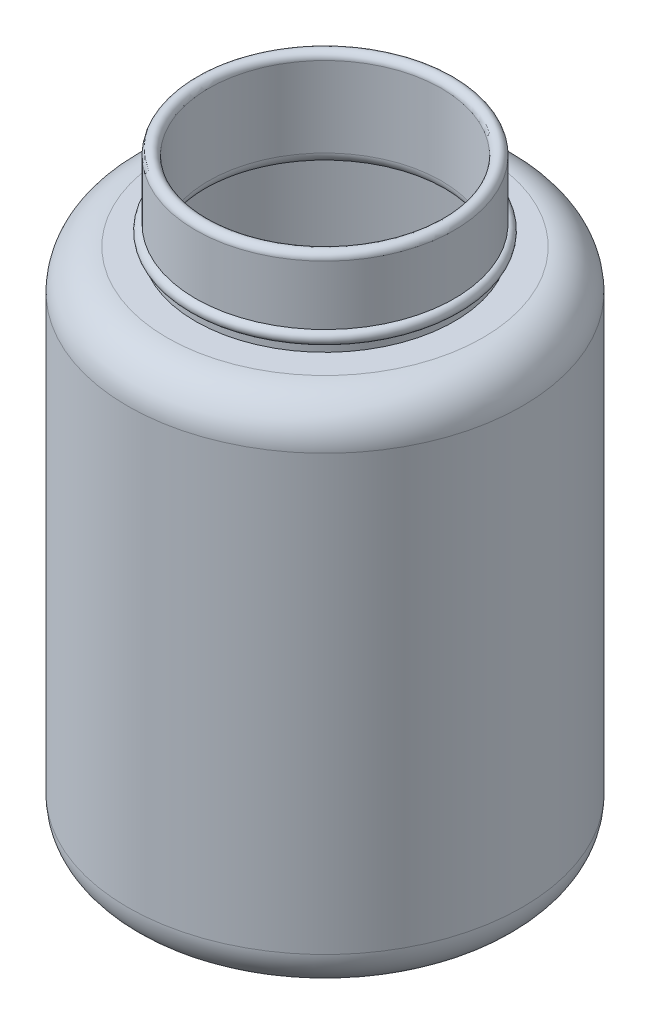
ISO-10303-21;
HEADER;
FILE_DESCRIPTION(('STEP AP214'),'2;1');
FILE_NAME('part.step','',(''),(''),'','','');
FILE_SCHEMA(('AUTOMOTIVE_DESIGN { 1 0 10303 214 1 1 1 1 }'));
ENDSEC;
DATA;
#1=APPLICATION_CONTEXT('core data for automotive mechanical design processes');
#2=APPLICATION_PROTOCOL_DEFINITION('international standard','automotive_design',2000,#1);
#3=PRODUCT_CONTEXT('',#1,'mechanical');
#4=PRODUCT('Part','Part','',(#3));
#5=PRODUCT_RELATED_PRODUCT_CATEGORY('part','',(#4));
#6=PRODUCT_DEFINITION_FORMATION('','',#4);
#7=PRODUCT_DEFINITION_CONTEXT('part definition',#1,'design');
#8=PRODUCT_DEFINITION('design','',#6,#7);
#9=PRODUCT_DEFINITION_SHAPE('','',#8);
#10=(LENGTH_UNIT() NAMED_UNIT(*) SI_UNIT(.MILLI.,.METRE.));
#11=(NAMED_UNIT(*) PLANE_ANGLE_UNIT() SI_UNIT($,.RADIAN.));
#12=(NAMED_UNIT(*) SI_UNIT($,.STERADIAN.) SOLID_ANGLE_UNIT());
#13=UNCERTAINTY_MEASURE_WITH_UNIT(LENGTH_MEASURE(1.E-05),#10,'distance_accuracy_value','');
#14=(GEOMETRIC_REPRESENTATION_CONTEXT(3) GLOBAL_UNCERTAINTY_ASSIGNED_CONTEXT((#13)) GLOBAL_UNIT_ASSIGNED_CONTEXT((#10,
#11,#12)) REPRESENTATION_CONTEXT('',''));
#15=CARTESIAN_POINT('',(0.,0.,0.));
#16=DIRECTION('',(0.,0.,1.));
#17=DIRECTION('',(1.,0.,0.));
#18=AXIS2_PLACEMENT_3D('',#15,#16,#17);
#19=CARTESIAN_POINT('',(0.,0.,0.));
#20=DIRECTION('',(0.,-1.,0.));
#21=DIRECTION('',(0.,0.,-1.));
#22=AXIS2_PLACEMENT_3D('',#19,#20,#21);
#23=PLANE('',#22);
#24=CARTESIAN_POINT('',(0.,0.,0.));
#25=DIRECTION('',(0.,-1.,0.));
#26=DIRECTION('',(0.,0.,-1.));
#27=AXIS2_PLACEMENT_3D('',#24,#25,#26);
#28=CIRCLE('',#27,39.9999999999999);
#29=CARTESIAN_POINT('',(0.,0.,-39.9999999999999));
#30=VERTEX_POINT('',#29);
#31=EDGE_CURVE('E10',#30,#30,#28,.T.);
#32=ORIENTED_EDGE('',*,*,#31,.T.);
#33=EDGE_LOOP('',(#32));
#34=FACE_BOUND('',#33,.T.);
#35=ADVANCED_FACE('F30',(#34),#23,.T.);
#36=CARTESIAN_POINT('',(0.,10.,0.));
#37=DIRECTION('',(0.,-1.,0.));
#38=DIRECTION('',(0.,0.,-1.));
#39=AXIS2_PLACEMENT_3D('',#36,#37,#38);
#40=TOROIDAL_SURFACE('',#39,40.,10.);
#41=CARTESIAN_POINT('',(0.,10.0000000000001,0.));
#42=DIRECTION('',(0.,-1.,0.));
#43=DIRECTION('',(0.,0.,-1.));
#44=AXIS2_PLACEMENT_3D('',#41,#42,#43);
#45=CIRCLE('',#44,50.);
#46=CARTESIAN_POINT('',(0.,10.0000000000001,-50.));
#47=VERTEX_POINT('',#46);
#48=EDGE_CURVE('E36',#47,#47,#45,.T.);
#49=ORIENTED_EDGE('',*,*,#48,.T.);
#50=EDGE_LOOP('',(#49));
#51=FACE_BOUND('',#50,.T.);
#52=ORIENTED_EDGE('',*,*,#31,.F.);
#53=EDGE_LOOP('',(#52));
#54=FACE_BOUND('',#53,.T.);
#55=ADVANCED_FACE('F95',(#51,#54),#40,.T.);
#56=CARTESIAN_POINT('',(0.,0.,0.));
#57=DIRECTION('',(0.,-1.,0.));
#58=DIRECTION('',(0.,0.,-1.));
#59=AXIS2_PLACEMENT_3D('',#56,#57,#58);
#60=CYLINDRICAL_SURFACE('',#59,50.);
#61=CARTESIAN_POINT('',(0.,120.,0.));
#62=DIRECTION('',(0.,-1.,0.));
#63=DIRECTION('',(0.,0.,-1.));
#64=AXIS2_PLACEMENT_3D('',#61,#62,#63);
#65=CIRCLE('',#64,50.);
#66=CARTESIAN_POINT('',(0.,120.,-50.));
#67=VERTEX_POINT('',#66);
#68=EDGE_CURVE('E40',#67,#67,#65,.T.);
#69=ORIENTED_EDGE('',*,*,#68,.T.);
#70=EDGE_LOOP('',(#69));
#71=FACE_BOUND('',#70,.T.);
#72=ORIENTED_EDGE('',*,*,#48,.F.);
#73=EDGE_LOOP('',(#72));
#74=FACE_BOUND('',#73,.T.);
#75=ADVANCED_FACE('F99',(#71,#74),#60,.T.);
#76=CARTESIAN_POINT('',(0.,120.,0.));
#77=DIRECTION('',(0.,-1.,0.));
#78=DIRECTION('',(0.,0.,-1.));
#79=AXIS2_PLACEMENT_3D('',#76,#77,#78);
#80=TOROIDAL_SURFACE('',#79,40.,10.);
#81=CARTESIAN_POINT('',(0.,130.,0.));
#82=DIRECTION('',(0.,-1.,0.));
#83=DIRECTION('',(0.,0.,-1.));
#84=AXIS2_PLACEMENT_3D('',#81,#82,#83);
#85=CIRCLE('',#84,40.);
#86=CARTESIAN_POINT('',(0.,130.,-40.));
#87=VERTEX_POINT('',#86);
#88=EDGE_CURVE('E44',#87,#87,#85,.T.);
#89=ORIENTED_EDGE('',*,*,#88,.T.);
#90=EDGE_LOOP('',(#89));
#91=FACE_BOUND('',#90,.T.);
#92=ORIENTED_EDGE('',*,*,#68,.F.);
#93=EDGE_LOOP('',(#92));
#94=FACE_BOUND('',#93,.T.);
#95=ADVANCED_FACE('F103',(#91,#94),#80,.T.);
#96=CARTESIAN_POINT('',(40.,130.,0.));
#97=DIRECTION('',(0.,1.,0.));
#98=DIRECTION('',(0.,0.,1.));
#99=AXIS2_PLACEMENT_3D('',#96,#97,#98);
#100=PLANE('',#99);
#101=CARTESIAN_POINT('',(0.,130.,0.));
#102=DIRECTION('',(0.,-1.,0.));
#103=DIRECTION('',(0.,0.,-1.));
#104=AXIS2_PLACEMENT_3D('',#101,#102,#103);
#105=CIRCLE('',#104,32.8);
#106=CARTESIAN_POINT('',(0.,130.,-32.8));
#107=VERTEX_POINT('',#106);
#108=EDGE_CURVE('E49',#107,#107,#105,.T.);
#109=ORIENTED_EDGE('',*,*,#108,.T.);
#110=EDGE_LOOP('',(#109));
#111=FACE_BOUND('',#110,.T.);
#112=ORIENTED_EDGE('',*,*,#88,.F.);
#113=EDGE_LOOP('',(#112));
#114=FACE_BOUND('',#113,.T.);
#115=ADVANCED_FACE('F110',(#111,#114),#100,.T.);
#116=CARTESIAN_POINT('',(0.,0.,0.));
#117=DIRECTION('',(0.,-1.,0.));
#118=DIRECTION('',(0.,0.,-1.));
#119=AXIS2_PLACEMENT_3D('',#116,#117,#118);
#120=CYLINDRICAL_SURFACE('',#119,32.8);
#121=CARTESIAN_POINT('',(0.,132.,0.));
#122=DIRECTION('',(0.,-1.,0.));
#123=DIRECTION('',(0.,0.,-1.));
#124=AXIS2_PLACEMENT_3D('',#121,#122,#123);
#125=CIRCLE('',#124,32.8);
#126=CARTESIAN_POINT('',(0.,132.,-32.8));
#127=VERTEX_POINT('',#126);
#128=EDGE_CURVE('E52',#127,#127,#125,.T.);
#129=ORIENTED_EDGE('',*,*,#128,.T.);
#130=EDGE_LOOP('',(#129));
#131=FACE_BOUND('',#130,.T.);
#132=ORIENTED_EDGE('',*,*,#108,.F.);
#133=EDGE_LOOP('',(#132));
#134=FACE_BOUND('',#133,.T.);
#135=ADVANCED_FACE('F114',(#131,#134),#120,.T.);
#136=CARTESIAN_POINT('',(0.,133.5,0.));
#137=DIRECTION('',(0.,-1.,0.));
#138=DIRECTION('',(0.,0.,-1.));
#139=AXIS2_PLACEMENT_3D('',#136,#137,#138);
#140=TOROIDAL_SURFACE('',#139,32.8,1.5);
#141=CARTESIAN_POINT('',(0.,135.,0.));
#142=DIRECTION('',(0.,-1.,0.));
#143=DIRECTION('',(0.,0.,-1.));
#144=AXIS2_PLACEMENT_3D('',#141,#142,#143);
#145=CIRCLE('',#144,32.8);
#146=CARTESIAN_POINT('',(0.,135.,-32.8));
#147=VERTEX_POINT('',#146);
#148=EDGE_CURVE('E55',#147,#147,#145,.T.);
#149=ORIENTED_EDGE('',*,*,#148,.T.);
#150=EDGE_LOOP('',(#149));
#151=FACE_BOUND('',#150,.T.);
#152=ORIENTED_EDGE('',*,*,#128,.F.);
#153=EDGE_LOOP('',(#152));
#154=FACE_BOUND('',#153,.T.);
#155=ADVANCED_FACE('F118',(#151,#154),#140,.T.);
#156=CARTESIAN_POINT('',(0.,0.,0.));
#157=DIRECTION('',(0.,-1.,0.));
#158=DIRECTION('',(0.,0.,-1.));
#159=AXIS2_PLACEMENT_3D('',#156,#157,#158);
#160=CYLINDRICAL_SURFACE('',#159,32.8);
#161=CARTESIAN_POINT('',(0.,150.,0.));
#162=DIRECTION('',(0.,-1.,0.));
#163=DIRECTION('',(0.,0.,-1.));
#164=AXIS2_PLACEMENT_3D('',#161,#162,#163);
#165=CIRCLE('',#164,32.8);
#166=CARTESIAN_POINT('',(0.,150.,-32.8));
#167=VERTEX_POINT('',#166);
#168=EDGE_CURVE('E58',#167,#167,#165,.T.);
#169=ORIENTED_EDGE('',*,*,#168,.T.);
#170=EDGE_LOOP('',(#169));
#171=FACE_BOUND('',#170,.T.);
#172=ORIENTED_EDGE('',*,*,#148,.F.);
#173=EDGE_LOOP('',(#172));
#174=FACE_BOUND('',#173,.T.);
#175=ADVANCED_FACE('F122',(#171,#174),#160,.T.);
#176=CARTESIAN_POINT('',(0.,150.,0.));
#177=DIRECTION('',(0.,-1.,0.));
#178=DIRECTION('',(0.,0.,-1.));
#179=AXIS2_PLACEMENT_3D('',#176,#177,#178);
#180=TOROIDAL_SURFACE('',#179,31.15,1.65);
#181=CARTESIAN_POINT('',(0.,150.,0.));
#182=DIRECTION('',(0.,-1.,0.));
#183=DIRECTION('',(0.,0.,-1.));
#184=AXIS2_PLACEMENT_3D('',#181,#182,#183);
#185=CIRCLE('',#184,29.5);
#186=CARTESIAN_POINT('',(0.,150.,-29.5));
#187=VERTEX_POINT('',#186);
#188=EDGE_CURVE('E61',#187,#187,#185,.T.);
#189=ORIENTED_EDGE('',*,*,#188,.T.);
#190=EDGE_LOOP('',(#189));
#191=FACE_BOUND('',#190,.T.);
#192=ORIENTED_EDGE('',*,*,#168,.F.);
#193=EDGE_LOOP('',(#192));
#194=FACE_BOUND('',#193,.T.);
#195=ADVANCED_FACE('F126',(#191,#194),#180,.T.);
#196=CARTESIAN_POINT('',(0.,0.,0.));
#197=DIRECTION('',(0.,-1.,0.));
#198=DIRECTION('',(0.,0.,-1.));
#199=AXIS2_PLACEMENT_3D('',#196,#197,#198);
#200=CYLINDRICAL_SURFACE('',#199,29.5);
#201=CARTESIAN_POINT('',(0.,129.7,0.));
#202=DIRECTION('',(0.,-1.,0.));
#203=DIRECTION('',(0.,0.,-1.));
#204=AXIS2_PLACEMENT_3D('',#201,#202,#203);
#205=CIRCLE('',#204,29.5);
#206=CARTESIAN_POINT('',(0.,129.7,-29.5));
#207=VERTEX_POINT('',#206);
#208=EDGE_CURVE('E64',#207,#207,#205,.T.);
#209=ORIENTED_EDGE('',*,*,#208,.T.);
#210=EDGE_LOOP('',(#209));
#211=FACE_BOUND('',#210,.T.);
#212=ORIENTED_EDGE('',*,*,#188,.F.);
#213=EDGE_LOOP('',(#212));
#214=FACE_BOUND('',#213,.T.);
#215=ADVANCED_FACE('F130',(#211,#214),#200,.F.);
#216=CARTESIAN_POINT('',(0.,129.7,0.));
#217=DIRECTION('',(0.,-1.,0.));
#218=DIRECTION('',(0.,0.,-1.));
#219=AXIS2_PLACEMENT_3D('',#216,#217,#218);
#220=TOROIDAL_SURFACE('',#219,32.5,3.);
#221=CARTESIAN_POINT('',(0.,126.7,0.));
#222=DIRECTION('',(0.,-1.,0.));
#223=DIRECTION('',(0.,0.,-1.));
#224=AXIS2_PLACEMENT_3D('',#221,#222,#223);
#225=CIRCLE('',#224,32.5);
#226=CARTESIAN_POINT('',(0.,126.7,-32.5));
#227=VERTEX_POINT('',#226);
#228=EDGE_CURVE('E67',#227,#227,#225,.T.);
#229=ORIENTED_EDGE('',*,*,#228,.T.);
#230=EDGE_LOOP('',(#229));
#231=FACE_BOUND('',#230,.T.);
#232=ORIENTED_EDGE('',*,*,#208,.F.);
#233=EDGE_LOOP('',(#232));
#234=FACE_BOUND('',#233,.T.);
#235=ADVANCED_FACE('F134',(#231,#234),#220,.T.);
#236=CARTESIAN_POINT('',(32.5,126.7,0.));
#237=DIRECTION('',(0.,-1.,0.));
#238=DIRECTION('',(0.,0.,-1.));
#239=AXIS2_PLACEMENT_3D('',#236,#237,#238);
#240=PLANE('',#239);
#241=CARTESIAN_POINT('',(0.,126.7,0.));
#242=DIRECTION('',(0.,-1.,0.));
#243=DIRECTION('',(0.,0.,-1.));
#244=AXIS2_PLACEMENT_3D('',#241,#242,#243);
#245=CIRCLE('',#244,40.);
#246=CARTESIAN_POINT('',(0.,126.7,-40.));
#247=VERTEX_POINT('',#246);
#248=EDGE_CURVE('E70',#247,#247,#245,.T.);
#249=ORIENTED_EDGE('',*,*,#248,.T.);
#250=EDGE_LOOP('',(#249));
#251=FACE_BOUND('',#250,.T.);
#252=ORIENTED_EDGE('',*,*,#228,.F.);
#253=EDGE_LOOP('',(#252));
#254=FACE_BOUND('',#253,.T.);
#255=ADVANCED_FACE('F138',(#251,#254),#240,.T.);
#256=CARTESIAN_POINT('',(0.,120.,0.));
#257=DIRECTION('',(0.,-1.,0.));
#258=DIRECTION('',(0.,0.,-1.));
#259=AXIS2_PLACEMENT_3D('',#256,#257,#258);
#260=TOROIDAL_SURFACE('',#259,40.,6.70000000000001);
#261=CARTESIAN_POINT('',(0.,120.,0.));
#262=DIRECTION('',(0.,-1.,0.));
#263=DIRECTION('',(0.,0.,-1.));
#264=AXIS2_PLACEMENT_3D('',#261,#262,#263);
#265=CIRCLE('',#264,46.7);
#266=CARTESIAN_POINT('',(0.,120.,-46.7));
#267=VERTEX_POINT('',#266);
#268=EDGE_CURVE('E73',#267,#267,#265,.T.);
#269=ORIENTED_EDGE('',*,*,#268,.T.);
#270=EDGE_LOOP('',(#269));
#271=FACE_BOUND('',#270,.T.);
#272=ORIENTED_EDGE('',*,*,#248,.F.);
#273=EDGE_LOOP('',(#272));
#274=FACE_BOUND('',#273,.T.);
#275=ADVANCED_FACE('F142',(#271,#274),#260,.F.);
#276=CARTESIAN_POINT('',(0.,0.,0.));
#277=DIRECTION('',(0.,-1.,0.));
#278=DIRECTION('',(0.,0.,-1.));
#279=AXIS2_PLACEMENT_3D('',#276,#277,#278);
#280=CYLINDRICAL_SURFACE('',#279,46.7);
#281=CARTESIAN_POINT('',(0.,9.99999999999993,0.));
#282=DIRECTION('',(0.,-1.,0.));
#283=DIRECTION('',(0.,0.,-1.));
#284=AXIS2_PLACEMENT_3D('',#281,#282,#283);
#285=CIRCLE('',#284,46.7);
#286=CARTESIAN_POINT('',(0.,9.99999999999993,-46.7));
#287=VERTEX_POINT('',#286);
#288=EDGE_CURVE('E76',#287,#287,#285,.T.);
#289=ORIENTED_EDGE('',*,*,#288,.T.);
#290=EDGE_LOOP('',(#289));
#291=FACE_BOUND('',#290,.T.);
#292=ORIENTED_EDGE('',*,*,#268,.F.);
#293=EDGE_LOOP('',(#292));
#294=FACE_BOUND('',#293,.T.);
#295=ADVANCED_FACE('F92',(#291,#294),#280,.F.);
#296=CARTESIAN_POINT('',(0.,10.,0.));
#297=DIRECTION('',(0.,-1.,0.));
#298=DIRECTION('',(0.,0.,-1.));
#299=AXIS2_PLACEMENT_3D('',#296,#297,#298);
#300=TOROIDAL_SURFACE('',#299,40.,6.7);
#301=CARTESIAN_POINT('',(0.,3.3,0.));
#302=DIRECTION('',(0.,-1.,0.));
#303=DIRECTION('',(0.,0.,-1.));
#304=AXIS2_PLACEMENT_3D('',#301,#302,#303);
#305=CIRCLE('',#304,39.9999999999999);
#306=CARTESIAN_POINT('',(0.,3.3,-39.9999999999999));
#307=VERTEX_POINT('',#306);
#308=EDGE_CURVE('E79',#307,#307,#305,.T.);
#309=ORIENTED_EDGE('',*,*,#308,.T.);
#310=EDGE_LOOP('',(#309));
#311=FACE_BOUND('',#310,.T.);
#312=ORIENTED_EDGE('',*,*,#288,.F.);
#313=EDGE_LOOP('',(#312));
#314=FACE_BOUND('',#313,.T.);
#315=ADVANCED_FACE('F83',(#311,#314),#300,.F.);
#316=CARTESIAN_POINT('',(0.,3.3,0.));
#317=DIRECTION('',(0.,1.,0.));
#318=DIRECTION('',(0.,0.,1.));
#319=AXIS2_PLACEMENT_3D('',#316,#317,#318);
#320=PLANE('',#319);
#321=ORIENTED_EDGE('',*,*,#308,.F.);
#322=EDGE_LOOP('',(#321));
#323=FACE_BOUND('',#322,.T.);
#324=ADVANCED_FACE('F86',(#323),#320,.T.);
#325=CLOSED_SHELL('',(#35,#55,#75,#95,#115,#135,#155,#175,#195,#215,#235,#255,#275,#295,#315,#324));
#326=MANIFOLD_SOLID_BREP('B2',#325);
#327=ADVANCED_BREP_SHAPE_REPRESENTATION('',(#18,#326),#14);
#328=SHAPE_DEFINITION_REPRESENTATION(#9,#327);
ENDSEC;
END-ISO-10303-21;
